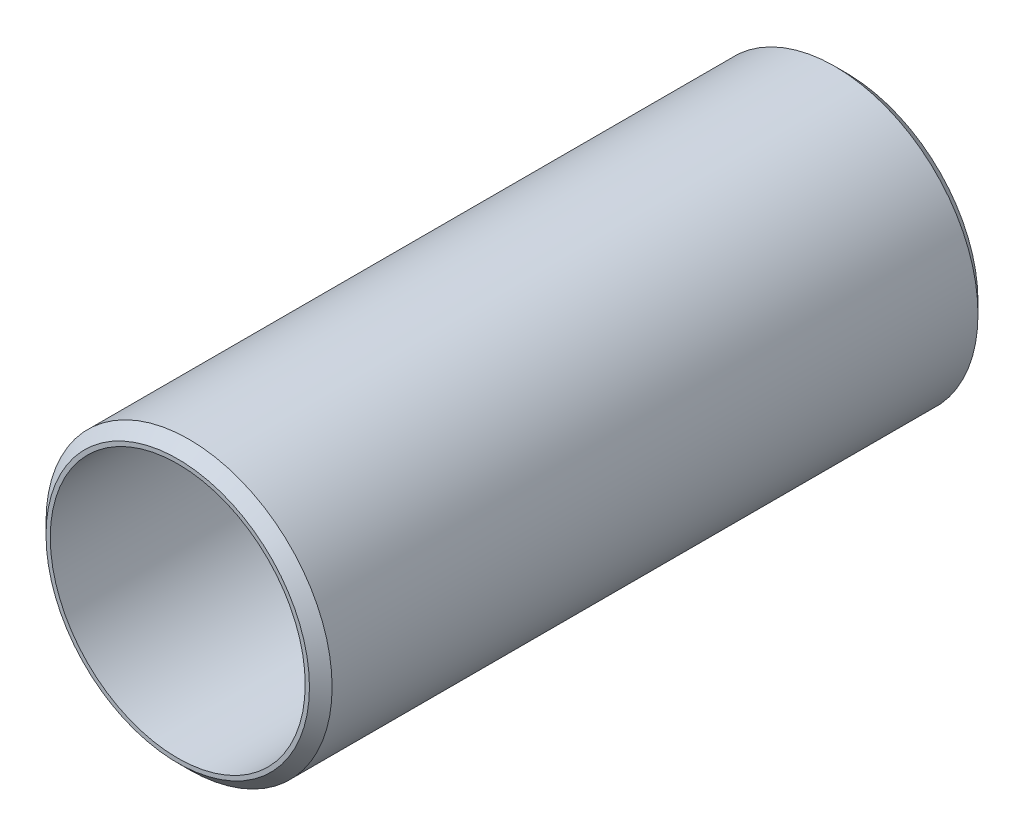
ISO-10303-21;
HEADER;
FILE_DESCRIPTION(('STEP AP214'),'2;1');
FILE_NAME('part.step','',(''),(''),'','','');
FILE_SCHEMA(('AUTOMOTIVE_DESIGN { 1 0 10303 214 1 1 1 1 }'));
ENDSEC;
DATA;
#1=APPLICATION_CONTEXT('core data for automotive mechanical design processes');
#2=APPLICATION_PROTOCOL_DEFINITION('international standard','automotive_design',2000,#1);
#3=PRODUCT_CONTEXT('',#1,'mechanical');
#4=PRODUCT('Part','Part','',(#3));
#5=PRODUCT_RELATED_PRODUCT_CATEGORY('part','',(#4));
#6=PRODUCT_DEFINITION_FORMATION('','',#4);
#7=PRODUCT_DEFINITION_CONTEXT('part definition',#1,'design');
#8=PRODUCT_DEFINITION('design','',#6,#7);
#9=PRODUCT_DEFINITION_SHAPE('','',#8);
#10=(LENGTH_UNIT() NAMED_UNIT(*) SI_UNIT(.MILLI.,.METRE.));
#11=(NAMED_UNIT(*) PLANE_ANGLE_UNIT() SI_UNIT($,.RADIAN.));
#12=(NAMED_UNIT(*) SI_UNIT($,.STERADIAN.) SOLID_ANGLE_UNIT());
#13=UNCERTAINTY_MEASURE_WITH_UNIT(LENGTH_MEASURE(1.E-05),#10,'distance_accuracy_value','');
#14=(GEOMETRIC_REPRESENTATION_CONTEXT(3) GLOBAL_UNCERTAINTY_ASSIGNED_CONTEXT((#13)) GLOBAL_UNIT_ASSIGNED_CONTEXT((#10,
#11,#12)) REPRESENTATION_CONTEXT('',''));
#15=CARTESIAN_POINT('',(0.,0.,0.));
#16=DIRECTION('',(0.,0.,1.));
#17=DIRECTION('',(1.,0.,0.));
#18=AXIS2_PLACEMENT_3D('',#15,#16,#17);
#19=CARTESIAN_POINT('',(96.2,-96.2,-6.2));
#20=DIRECTION('',(0.,0.,1.));
#21=DIRECTION('',(1.,0.,0.));
#22=AXIS2_PLACEMENT_3D('',#19,#20,#21);
#23=PLANE('',#22);
#24=CARTESIAN_POINT('',(96.2,-96.2,-6.2));
#25=DIRECTION('',(0.,0.,1.));
#26=DIRECTION('',(1.,0.,0.));
#27=AXIS2_PLACEMENT_3D('',#24,#25,#26);
#28=CIRCLE('',#27,0.8);
#29=CARTESIAN_POINT('',(97.,-96.2,-6.2));
#30=VERTEX_POINT('',#29);
#31=EDGE_CURVE('E43',#30,#30,#28,.F.);
#32=ORIENTED_EDGE('',*,*,#31,.T.);
#33=EDGE_LOOP('',(#32));
#34=FACE_BOUND('',#33,.T.);
#35=CARTESIAN_POINT('',(96.2,-96.2,-6.2));
#36=DIRECTION('',(0.,0.,1.));
#37=DIRECTION('',(1.,0.,0.));
#38=AXIS2_PLACEMENT_3D('',#35,#36,#37);
#39=CIRCLE('',#38,2.25);
#40=CARTESIAN_POINT('',(98.45,-96.2,-6.2));
#41=VERTEX_POINT('',#40);
#42=EDGE_CURVE('E17',#41,#41,#39,.T.);
#43=ORIENTED_EDGE('',*,*,#42,.T.);
#44=EDGE_LOOP('',(#43));
#45=FACE_BOUND('',#44,.T.);
#46=ADVANCED_FACE('F14',(#34,#45),#23,.T.);
#47=CARTESIAN_POINT('',(96.2,-96.2,-6.4));
#48=DIRECTION('',(0.,0.,1.));
#49=DIRECTION('',(1.,0.,0.));
#50=AXIS2_PLACEMENT_3D('',#47,#48,#49);
#51=CYLINDRICAL_SURFACE('',#50,2.25);
#52=ORIENTED_EDGE('',*,*,#42,.F.);
#53=EDGE_LOOP('',(#52));
#54=FACE_BOUND('',#53,.T.);
#55=CARTESIAN_POINT('',(96.2,-96.2,3.8));
#56=DIRECTION('',(0.,0.,1.));
#57=DIRECTION('',(1.,0.,0.));
#58=AXIS2_PLACEMENT_3D('',#55,#56,#57);
#59=CIRCLE('',#58,2.25);
#60=CARTESIAN_POINT('',(98.45,-96.2,3.8));
#61=VERTEX_POINT('',#60);
#62=EDGE_CURVE('E41',#61,#61,#59,.F.);
#63=ORIENTED_EDGE('',*,*,#62,.F.);
#64=EDGE_LOOP('',(#63));
#65=FACE_BOUND('',#64,.T.);
#66=ADVANCED_FACE('F51',(#54,#65),#51,.F.);
#67=CARTESIAN_POINT('',(96.2,-96.2,-8.036));
#68=DIRECTION('',(0.,0.,1.));
#69=DIRECTION('',(1.,0.,0.));
#70=AXIS2_PLACEMENT_3D('',#67,#68,#69);
#71=CYLINDRICAL_SURFACE('',#70,0.8);
#72=CARTESIAN_POINT('',(96.2,-96.2,-8.));
#73=DIRECTION('',(0.,0.,1.));
#74=DIRECTION('',(1.,0.,0.));
#75=AXIS2_PLACEMENT_3D('',#72,#73,#74);
#76=CIRCLE('',#75,0.8);
#77=CARTESIAN_POINT('',(97.,-96.2,-8.));
#78=VERTEX_POINT('',#77);
#79=EDGE_CURVE('E38',#78,#78,#76,.F.);
#80=ORIENTED_EDGE('',*,*,#79,.T.);
#81=EDGE_LOOP('',(#80));
#82=FACE_BOUND('',#81,.T.);
#83=ORIENTED_EDGE('',*,*,#31,.F.);
#84=EDGE_LOOP('',(#83));
#85=FACE_BOUND('',#84,.T.);
#86=ADVANCED_FACE('F54',(#82,#85),#71,.F.);
#87=CARTESIAN_POINT('',(96.2,-96.2,3.8));
#88=DIRECTION('',(0.,0.,1.));
#89=DIRECTION('',(1.,0.,0.));
#90=AXIS2_PLACEMENT_3D('',#87,#88,#89);
#91=PLANE('',#90);
#92=ORIENTED_EDGE('',*,*,#62,.T.);
#93=EDGE_LOOP('',(#92));
#94=FACE_BOUND('',#93,.T.);
#95=CARTESIAN_POINT('',(96.2,-96.2,3.8));
#96=DIRECTION('',(0.,0.,1.));
#97=DIRECTION('',(1.,0.,0.));
#98=AXIS2_PLACEMENT_3D('',#95,#96,#97);
#99=CIRCLE('',#98,2.32507074407919);
#100=CARTESIAN_POINT('',(98.5250707440792,-96.2,3.8));
#101=VERTEX_POINT('',#100);
#102=EDGE_CURVE('E35',#101,#101,#99,.F.);
#103=ORIENTED_EDGE('',*,*,#102,.F.);
#104=EDGE_LOOP('',(#103));
#105=FACE_BOUND('',#104,.T.);
#106=ADVANCED_FACE('F57',(#94,#105),#91,.T.);
#107=CARTESIAN_POINT('',(96.2,-96.2,-8.));
#108=DIRECTION('',(0.,0.,1.));
#109=DIRECTION('',(1.,0.,0.));
#110=AXIS2_PLACEMENT_3D('',#107,#108,#109);
#111=PLANE('',#110);
#112=ORIENTED_EDGE('',*,*,#79,.F.);
#113=EDGE_LOOP('',(#112));
#114=FACE_BOUND('',#113,.T.);
#115=CARTESIAN_POINT('',(96.2,-96.2,-8.));
#116=DIRECTION('',(0.,0.,1.));
#117=DIRECTION('',(1.,0.,0.));
#118=AXIS2_PLACEMENT_3D('',#115,#116,#117);
#119=CIRCLE('',#118,2.3250707440481);
#120=CARTESIAN_POINT('',(98.5250707440481,-96.2,-8.));
#121=VERTEX_POINT('',#120);
#122=EDGE_CURVE('E26',#121,#121,#119,.T.);
#123=ORIENTED_EDGE('',*,*,#122,.F.);
#124=EDGE_LOOP('',(#123));
#125=FACE_BOUND('',#124,.T.);
#126=ADVANCED_FACE('F60',(#114,#125),#111,.F.);
#127=CARTESIAN_POINT('',(96.2,-96.2,3.59879607577795));
#128=DIRECTION('',(0.,0.,-1.));
#129=DIRECTION('',(-1.,0.,0.));
#130=AXIS2_PLACEMENT_3D('',#127,#128,#129);
#131=CONICAL_SURFACE('',#130,2.52628079043798,0.785413376926778);
#132=CARTESIAN_POINT('',(96.2,-96.2,3.60007682724585));
#133=DIRECTION('',(0.,0.,-1.));
#134=DIRECTION('',(-1.,0.,0.));
#135=AXIS2_PLACEMENT_3D('',#132,#133,#134);
#136=CIRCLE('',#135,2.525);
#137=CARTESIAN_POINT('',(93.675,-96.2,3.60007682724585));
#138=VERTEX_POINT('',#137);
#139=EDGE_CURVE('E21',#138,#138,#136,.T.);
#140=ORIENTED_EDGE('',*,*,#139,.F.);
#141=EDGE_LOOP('',(#140));
#142=FACE_BOUND('',#141,.T.);
#143=ORIENTED_EDGE('',*,*,#102,.T.);
#144=EDGE_LOOP('',(#143));
#145=FACE_BOUND('',#144,.T.);
#146=ADVANCED_FACE('F64',(#142,#145),#131,.T.);
#147=CARTESIAN_POINT('',(96.2,-96.2,-7.79882131797649));
#148=DIRECTION('',(0.,0.,1.));
#149=DIRECTION('',(1.,0.,0.));
#150=AXIS2_PLACEMENT_3D('',#147,#148,#149);
#151=CONICAL_SURFACE('',#150,2.52625554746938,0.785413376999055);
#152=CARTESIAN_POINT('',(96.2,-96.2,-7.80007682724365));
#153=DIRECTION('',(0.,0.,1.));
#154=DIRECTION('',(1.,0.,0.));
#155=AXIS2_PLACEMENT_3D('',#152,#153,#154);
#156=CIRCLE('',#155,2.525);
#157=CARTESIAN_POINT('',(98.725,-96.2,-7.80007682724365));
#158=VERTEX_POINT('',#157);
#159=EDGE_CURVE('E10',#158,#158,#156,.T.);
#160=ORIENTED_EDGE('',*,*,#159,.F.);
#161=EDGE_LOOP('',(#160));
#162=FACE_BOUND('',#161,.T.);
#163=ORIENTED_EDGE('',*,*,#122,.T.);
#164=EDGE_LOOP('',(#163));
#165=FACE_BOUND('',#164,.T.);
#166=ADVANCED_FACE('F66',(#162,#165),#151,.T.);
#167=CARTESIAN_POINT('',(96.2,-96.2,-8.027996397762));
#168=DIRECTION('',(0.,0.,1.));
#169=DIRECTION('',(1.,0.,0.));
#170=AXIS2_PLACEMENT_3D('',#167,#168,#169);
#171=CYLINDRICAL_SURFACE('',#170,2.525);
#172=ORIENTED_EDGE('',*,*,#139,.T.);
#173=EDGE_LOOP('',(#172));
#174=FACE_BOUND('',#173,.T.);
#175=ORIENTED_EDGE('',*,*,#159,.T.);
#176=EDGE_LOOP('',(#175));
#177=FACE_BOUND('',#176,.T.);
#178=ADVANCED_FACE('F74',(#174,#177),#171,.T.);
#179=CLOSED_SHELL('',(#46,#66,#86,#106,#126,#146,#166,#178));
#180=MANIFOLD_SOLID_BREP('B1',#179);
#181=ADVANCED_BREP_SHAPE_REPRESENTATION('',(#18,#180),#14);
#182=SHAPE_DEFINITION_REPRESENTATION(#9,#181);
ENDSEC;
END-ISO-10303-21;
